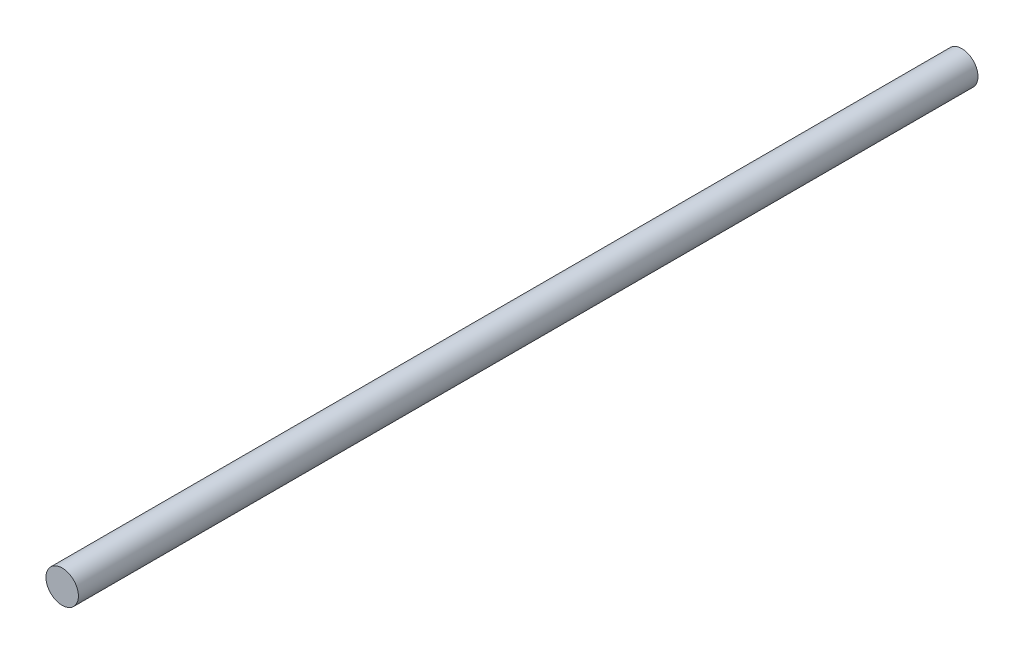
ISO-10303-21;
HEADER;
FILE_DESCRIPTION(('STEP AP214'),'2;1');
FILE_NAME('part.step','',(''),(''),'','','');
FILE_SCHEMA(('AUTOMOTIVE_DESIGN { 1 0 10303 214 1 1 1 1 }'));
ENDSEC;
DATA;
#1=APPLICATION_CONTEXT('core data for automotive mechanical design processes');
#2=APPLICATION_PROTOCOL_DEFINITION('international standard','automotive_design',2000,#1);
#3=PRODUCT_CONTEXT('',#1,'mechanical');
#4=PRODUCT('Part','Part','',(#3));
#5=PRODUCT_RELATED_PRODUCT_CATEGORY('part','',(#4));
#6=PRODUCT_DEFINITION_FORMATION('','',#4);
#7=PRODUCT_DEFINITION_CONTEXT('part definition',#1,'design');
#8=PRODUCT_DEFINITION('design','',#6,#7);
#9=PRODUCT_DEFINITION_SHAPE('','',#8);
#10=(LENGTH_UNIT() NAMED_UNIT(*) SI_UNIT(.MILLI.,.METRE.));
#11=(NAMED_UNIT(*) PLANE_ANGLE_UNIT() SI_UNIT($,.RADIAN.));
#12=(NAMED_UNIT(*) SI_UNIT($,.STERADIAN.) SOLID_ANGLE_UNIT());
#13=UNCERTAINTY_MEASURE_WITH_UNIT(LENGTH_MEASURE(1.E-05),#10,'distance_accuracy_value','');
#14=(GEOMETRIC_REPRESENTATION_CONTEXT(3) GLOBAL_UNCERTAINTY_ASSIGNED_CONTEXT((#13)) GLOBAL_UNIT_ASSIGNED_CONTEXT((#10,
#11,#12)) REPRESENTATION_CONTEXT('',''));
#15=CARTESIAN_POINT('',(0.,0.,0.));
#16=DIRECTION('',(0.,0.,1.));
#17=DIRECTION('',(1.,0.,0.));
#18=AXIS2_PLACEMENT_3D('',#15,#16,#17);
#19=CARTESIAN_POINT('',(0.,0.,222.));
#20=DIRECTION('',(0.,0.,-1.));
#21=DIRECTION('',(-1.,0.,0.));
#22=AXIS2_PLACEMENT_3D('',#19,#20,#21);
#23=CYLINDRICAL_SURFACE('',#22,4.);
#24=CARTESIAN_POINT('',(0.,0.,222.));
#25=DIRECTION('',(0.,0.,1.));
#26=DIRECTION('',(1.,0.,0.));
#27=AXIS2_PLACEMENT_3D('',#24,#25,#26);
#28=CIRCLE('',#27,4.);
#29=CARTESIAN_POINT('',(4.,0.,222.));
#30=VERTEX_POINT('',#29);
#31=EDGE_CURVE('E10',#30,#30,#28,.T.);
#32=ORIENTED_EDGE('',*,*,#31,.F.);
#33=EDGE_LOOP('',(#32));
#34=FACE_BOUND('',#33,.T.);
#35=CARTESIAN_POINT('',(0.,0.,0.));
#36=DIRECTION('',(0.,0.,1.));
#37=DIRECTION('',(1.,0.,0.));
#38=AXIS2_PLACEMENT_3D('',#35,#36,#37);
#39=CIRCLE('',#38,4.);
#40=CARTESIAN_POINT('',(4.,0.,0.));
#41=VERTEX_POINT('',#40);
#42=EDGE_CURVE('E40',#41,#41,#39,.T.);
#43=ORIENTED_EDGE('',*,*,#42,.T.);
#44=EDGE_LOOP('',(#43));
#45=FACE_BOUND('',#44,.T.);
#46=ADVANCED_FACE('F37',(#34,#45),#23,.T.);
#47=CARTESIAN_POINT('',(0.,0.,222.));
#48=DIRECTION('',(0.,0.,1.));
#49=DIRECTION('',(1.,0.,0.));
#50=AXIS2_PLACEMENT_3D('',#47,#48,#49);
#51=PLANE('',#50);
#52=ORIENTED_EDGE('',*,*,#31,.T.);
#53=EDGE_LOOP('',(#52));
#54=FACE_BOUND('',#53,.T.);
#55=ADVANCED_FACE('F52',(#54),#51,.T.);
#56=CARTESIAN_POINT('',(0.,0.,0.));
#57=DIRECTION('',(0.,0.,1.));
#58=DIRECTION('',(1.,0.,0.));
#59=AXIS2_PLACEMENT_3D('',#56,#57,#58);
#60=PLANE('',#59);
#61=ORIENTED_EDGE('',*,*,#42,.F.);
#62=EDGE_LOOP('',(#61));
#63=FACE_BOUND('',#62,.T.);
#64=ADVANCED_FACE('F50',(#63),#60,.F.);
#65=CLOSED_SHELL('',(#46,#55,#64));
#66=MANIFOLD_SOLID_BREP('B2',#65);
#67=ADVANCED_BREP_SHAPE_REPRESENTATION('',(#18,#66),#14);
#68=SHAPE_DEFINITION_REPRESENTATION(#9,#67);
ENDSEC;
END-ISO-10303-21;
